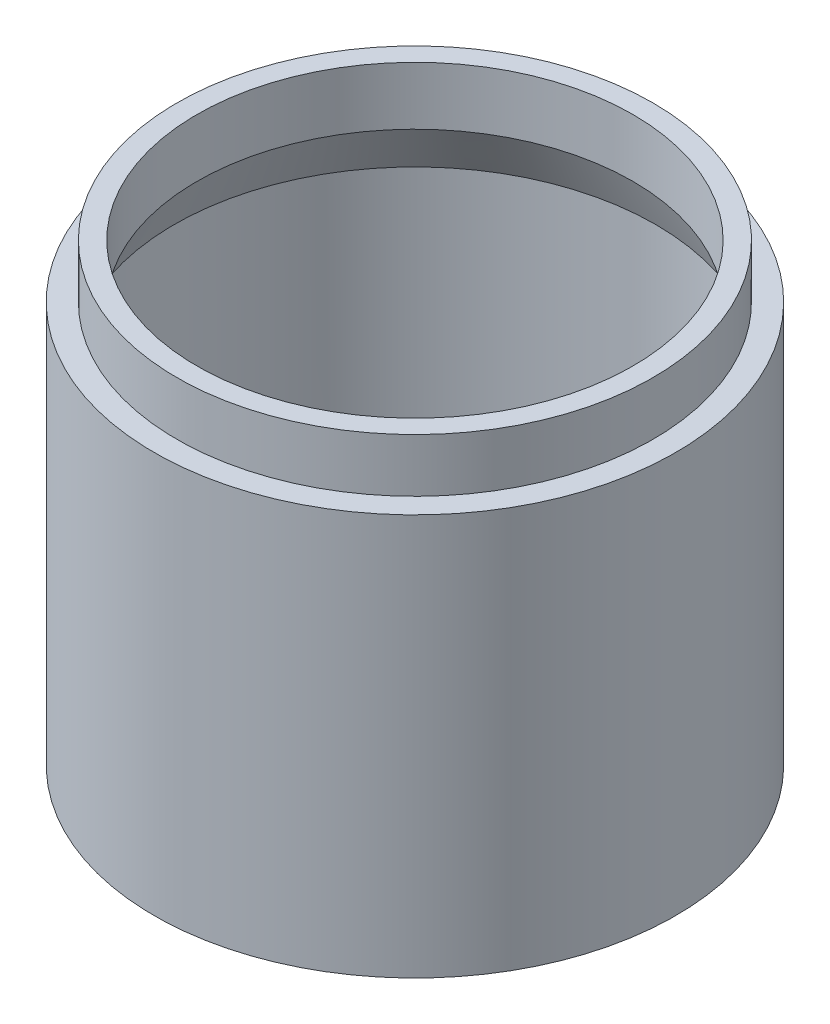
ISO-10303-21;
HEADER;
FILE_DESCRIPTION(('STEP AP214'),'2;1');
FILE_NAME('part.step','',(''),(''),'','','');
FILE_SCHEMA(('AUTOMOTIVE_DESIGN { 1 0 10303 214 1 1 1 1 }'));
ENDSEC;
DATA;
#1=APPLICATION_CONTEXT('core data for automotive mechanical design processes');
#2=APPLICATION_PROTOCOL_DEFINITION('international standard','automotive_design',2000,#1);
#3=PRODUCT_CONTEXT('',#1,'mechanical');
#4=PRODUCT('Part','Part','',(#3));
#5=PRODUCT_RELATED_PRODUCT_CATEGORY('part','',(#4));
#6=PRODUCT_DEFINITION_FORMATION('','',#4);
#7=PRODUCT_DEFINITION_CONTEXT('part definition',#1,'design');
#8=PRODUCT_DEFINITION('design','',#6,#7);
#9=PRODUCT_DEFINITION_SHAPE('','',#8);
#10=(LENGTH_UNIT() NAMED_UNIT(*) SI_UNIT(.MILLI.,.METRE.));
#11=(NAMED_UNIT(*) PLANE_ANGLE_UNIT() SI_UNIT($,.RADIAN.));
#12=(NAMED_UNIT(*) SI_UNIT($,.STERADIAN.) SOLID_ANGLE_UNIT());
#13=UNCERTAINTY_MEASURE_WITH_UNIT(LENGTH_MEASURE(1.E-05),#10,'distance_accuracy_value','');
#14=(GEOMETRIC_REPRESENTATION_CONTEXT(3) GLOBAL_UNCERTAINTY_ASSIGNED_CONTEXT((#13)) GLOBAL_UNIT_ASSIGNED_CONTEXT((#10,
#11,#12)) REPRESENTATION_CONTEXT('',''));
#15=CARTESIAN_POINT('',(0.,0.,0.));
#16=DIRECTION('',(0.,0.,1.));
#17=DIRECTION('',(1.,0.,0.));
#18=AXIS2_PLACEMENT_3D('',#15,#16,#17);
#19=CARTESIAN_POINT('',(0.,0.,0.));
#20=DIRECTION('',(0.,-1.,0.));
#21=DIRECTION('',(0.,0.,-1.));
#22=AXIS2_PLACEMENT_3D('',#19,#20,#21);
#23=CYLINDRICAL_SURFACE('',#22,45.72);
#24=CARTESIAN_POINT('',(0.,-10.1046375474299,0.));
#25=DIRECTION('',(0.,-1.,0.));
#26=DIRECTION('',(0.,0.,-1.));
#27=AXIS2_PLACEMENT_3D('',#24,#25,#26);
#28=CIRCLE('',#27,45.72);
#29=CARTESIAN_POINT('',(0.,-10.1046375474299,-45.72));
#30=VERTEX_POINT('',#29);
#31=EDGE_CURVE('E142',#30,#30,#28,.T.);
#32=ORIENTED_EDGE('',*,*,#31,.F.);
#33=EDGE_LOOP('',(#32));
#34=FACE_BOUND('',#33,.T.);
#35=CARTESIAN_POINT('',(0.,-73.66,0.));
#36=DIRECTION('',(0.,-1.,0.));
#37=DIRECTION('',(0.,0.,-1.));
#38=AXIS2_PLACEMENT_3D('',#35,#36,#37);
#39=CIRCLE('',#38,45.72);
#40=CARTESIAN_POINT('',(45.5034105864604,-73.66,4.44500000000003));
#41=VERTEX_POINT('',#40);
#42=CARTESIAN_POINT('',(-45.5034105864604,-73.66,4.44500000000002));
#43=VERTEX_POINT('',#42);
#44=EDGE_CURVE('E99',#41,#43,#39,.T.);
#45=ORIENTED_EDGE('',*,*,#44,.T.);
#46=CARTESIAN_POINT('',(-45.5034105864604,-73.66,-4.44499999999998));
#47=CARTESIAN_POINT('',(-45.5034053666458,-73.5352969190242,-4.44501376809316));
#48=CARTESIAN_POINT('',(-45.50392303603,-73.4105962105472,-4.43975282545134));
#49=CARTESIAN_POINT('',(-45.5059663925506,-73.1620927551427,-4.4187812644743));
#50=CARTESIAN_POINT('',(-45.5074920137328,-73.0382899499977,-4.40307132985666));
#51=CARTESIAN_POINT('',(-45.5115117193502,-72.7925691862634,-4.36132023399555));
#52=CARTESIAN_POINT('',(-45.5140049341397,-72.6706496370818,-4.3352883493738));
#53=CARTESIAN_POINT('',(-45.5198869212383,-72.4294480382064,-4.27308743638151));
#54=CARTESIAN_POINT('',(-45.523275686007,-72.3101659663143,-4.23691849336493));
#55=CARTESIAN_POINT('',(-45.5308533042162,-72.0750587151427,-4.15469600150712));
#56=CARTESIAN_POINT('',(-45.5350423155661,-71.9592342233577,-4.10864050156992));
#57=CARTESIAN_POINT('',(-45.5441023834616,-71.7318404388327,-4.00696181092924));
#58=CARTESIAN_POINT('',(-45.5489736916022,-71.6202727351689,-3.95133508912879));
#59=CARTESIAN_POINT('',(-45.5592564154922,-71.4022753165274,-3.83095292634324));
#60=CARTESIAN_POINT('',(-45.5646675608258,-71.2958430683401,-3.76620204920287));
#61=CARTESIAN_POINT('',(-45.5758811406676,-71.0887625592665,-3.62798366601361));
#62=CARTESIAN_POINT('',(-45.5816837193799,-70.9881164555675,-3.5545129399185));
#63=CARTESIAN_POINT('',(-45.593530159417,-70.7930997501469,-3.39918925279466));
#64=CARTESIAN_POINT('',(-45.5995746093437,-70.6987461609632,-3.31731497594981));
#65=CARTESIAN_POINT('',(-45.6117218437085,-70.517230522534,-3.14588851409613));
#66=CARTESIAN_POINT('',(-45.6178246488829,-70.4300711443778,-3.05633350229972));
#67=CARTESIAN_POINT('',(-45.6299125978487,-70.2636136921363,-2.87022092290477));
#68=CARTESIAN_POINT('',(-45.6358977667623,-70.1843139246184,-2.77366487154837));
#69=CARTESIAN_POINT('',(-45.6475849771005,-70.034086125315,-2.57417377143073));
#70=CARTESIAN_POINT('',(-45.6532869132164,-69.9631611940737,-2.47123638153558));
#71=CARTESIAN_POINT('',(-45.66425289633,-69.8301146256498,-2.25956937996069));
#72=CARTESIAN_POINT('',(-45.6695162312201,-69.7680071936934,-2.15083080152459));
#73=CARTESIAN_POINT('',(-45.6794473737766,-69.6531541759551,-1.92843975753886));
#74=CARTESIAN_POINT('',(-45.6841149602214,-69.6004120650065,-1.81478548747972));
#75=CARTESIAN_POINT('',(-45.6927176594075,-69.5047209503314,-1.58345823959493));
#76=CARTESIAN_POINT('',(-45.696653099109,-69.4617675732403,-1.46578708353981));
#77=CARTESIAN_POINT('',(-45.7036835891405,-69.3859218372686,-1.22717657758366));
#78=CARTESIAN_POINT('',(-45.7067783309095,-69.3530331718768,-1.1062360455832));
#79=CARTESIAN_POINT('',(-45.7120273889768,-69.2976797065146,-0.862408433279506));
#80=CARTESIAN_POINT('',(-45.7141849791202,-69.2751786010432,-0.739529709092874));
#81=CARTESIAN_POINT('',(-45.7175172910723,-69.2405792393519,-0.492306327812328));
#82=CARTESIAN_POINT('',(-45.7186916710113,-69.2284846014999,-0.367961176057563));
#83=CARTESIAN_POINT('',(-45.7206741721363,-69.2080255266906,0.00594951787953886));
#84=CARTESIAN_POINT('',(-45.7199474507037,-69.2154263255315,0.256653560762508));
#85=CARTESIAN_POINT('',(-45.7158526624879,-69.2578531698899,0.628267289358214));
#86=CARTESIAN_POINT('',(-45.7139908717547,-69.2771755953538,0.7512570066208));
#87=CARTESIAN_POINT('',(-45.7093299429959,-69.3260538571995,0.995171133847586));
#88=CARTESIAN_POINT('',(-45.7065311307986,-69.3556061364995,1.11609624639117));
#89=CARTESIAN_POINT('',(-45.7000716211195,-69.4247494543779,1.35505194352472));
#90=CARTESIAN_POINT('',(-45.6964106148083,-69.4643440904206,1.47308147418029));
#91=CARTESIAN_POINT('',(-45.6883321731246,-69.5532638195735,1.70534354280867));
#92=CARTESIAN_POINT('',(-45.683915012355,-69.6025853812668,1.81957744127199));
#93=CARTESIAN_POINT('',(-45.6744373630694,-69.7107268669212,2.04371795450332));
#94=CARTESIAN_POINT('',(-45.6693755733114,-69.7695660698713,2.15361521072923));
#95=CARTESIAN_POINT('',(-45.6587601084293,-69.8962280860313,2.36802529891206));
#96=CARTESIAN_POINT('',(-45.6532066130589,-69.9640476207407,2.47254007663247));
#97=CARTESIAN_POINT('',(-45.6417600808302,-70.1082324900575,2.67553300070175));
#98=CARTESIAN_POINT('',(-45.6358669276081,-70.1846007619304,2.77400905410281));
#99=CARTESIAN_POINT('',(-45.623910513422,-70.3452977227731,2.96416325195119));
#100=CARTESIAN_POINT('',(-45.6178473152296,-70.4296235007438,3.05584386054922));
#101=CARTESIAN_POINT('',(-45.6056923634233,-70.6060554038518,3.23219308796624));
#102=CARTESIAN_POINT('',(-45.5996006010872,-70.6981939982481,3.31682922535725));
#103=CARTESIAN_POINT('',(-45.5875900343433,-70.8892467143039,3.47801176012189));
#104=CARTESIAN_POINT('',(-45.5816711672893,-70.9881583372878,3.55456111461643));
#105=CARTESIAN_POINT('',(-45.5701681752192,-71.1921611742727,3.69911274652491));
#106=CARTESIAN_POINT('',(-45.5645842797341,-71.2972565300094,3.76710919749373));
#107=CARTESIAN_POINT('',(-45.5539167353921,-71.5127847955353,3.89398555175274));
#108=CARTESIAN_POINT('',(-45.5488329009367,-71.6232157021593,3.95286884209736));
#109=CARTESIAN_POINT('',(-45.5393027802207,-71.8488027643524,4.06118993854184));
#110=CARTESIAN_POINT('',(-45.5348572465654,-71.9639642953315,4.11061661702968));
#111=CARTESIAN_POINT('',(-45.5267400728283,-72.1980289976996,4.19956350385286));
#112=CARTESIAN_POINT('',(-45.5230681395086,-72.3169307316285,4.23908746695137));
#113=CARTESIAN_POINT('',(-45.5166053047668,-72.5575343869774,4.3079271673387));
#114=CARTESIAN_POINT('',(-45.5138134524328,-72.6792331326196,4.33725392608083));
#115=CARTESIAN_POINT('',(-45.5091869029959,-72.9246393339078,4.38553268694374));
#116=CARTESIAN_POINT('',(-45.5073517398428,-73.0483457811612,4.40448974087812));
#117=CARTESIAN_POINT('',(-45.5051533729861,-73.2535894524837,4.42713173450527));
#118=CARTESIAN_POINT('',(-45.5045000958908,-73.3348027377774,4.43383641795046));
#119=CARTESIAN_POINT('',(-45.5036286816613,-73.497341265294,4.44276746742395));
#120=CARTESIAN_POINT('',(-45.5034098188453,-73.578666093327,4.44500130198192));
#121=CARTESIAN_POINT('',(-45.5034105864604,-73.66,4.44500000000002));
#122=B_SPLINE_CURVE_WITH_KNOTS('',3,(#46,#47,#48,#49,#50,#51,#52,#53,#54,#55,#56,#57,#58,#59,
#60,#61,#62,#63,#64,#65,#66,#67,#68,#69,#70,#71,#72,#73,#74,#75,#76,#77,#78,#79,#80,#81,#82,#83,
#84,#85,#86,#87,#88,#89,#90,#91,#92,#93,#94,#95,#96,#97,#98,#99,#100,#101,#102,#103,#104,#105,
#106,#107,#108,#109,#110,#111,#112,#113,#114,#115,#116,#117,#118,#119,#120,#121),.UNSPECIFIED.,
.F.,.F.,(4,2,2,2,2,2,2,2,2,2,2,2,2,2,2,2,2,2,2,2,2,2,2,2,2,2,2,2,2,2,2,2,2,2,2,2,2,4),(0.,
0.373993814862765,0.747963160284568,1.12159716815652,1.49522803012752,1.86893269544173,
2.24277552785612,2.61643202587905,2.99022693878813,3.36499459069129,3.7399007673994,
4.11472599036728,4.48968954945684,4.86525049178544,5.24095048937785,5.61648230297382,
5.99215176222695,6.36649809101354,6.74097452888663,7.48912722561356,7.86233236853873,
8.2354078722758,8.60861721174724,8.98169130401254,9.3555307849144,9.72923416047709,
10.1030663334075,10.4767622780558,10.8520954927055,11.2272909794276,11.6027406898808,
11.97805052149,12.35379930073,12.7294053928372,13.104604247072,13.4796201523572,
13.7239814456942,13.9679341929181),.UNSPECIFIED.);
#123=CARTESIAN_POINT('',(-45.5034105864604,-73.66,-4.44499999999998));
#124=VERTEX_POINT('',#123);
#125=EDGE_CURVE('E188',#124,#43,#122,.T.);
#126=ORIENTED_EDGE('',*,*,#125,.F.);
#127=CARTESIAN_POINT('',(45.5034105864604,-73.66,-4.44499999999998));
#128=VERTEX_POINT('',#127);
#129=EDGE_CURVE('E115',#124,#128,#39,.T.);
#130=ORIENTED_EDGE('',*,*,#129,.T.);
#131=CARTESIAN_POINT('',(45.5034105864604,-73.66,-4.44499999999998));
#132=CARTESIAN_POINT('',(45.5034053666458,-73.5352969190242,-4.44501376809316));
#133=CARTESIAN_POINT('',(45.50392303603,-73.4105962105472,-4.43975282545134));
#134=CARTESIAN_POINT('',(45.5059663925506,-73.1620927551427,-4.4187812644743));
#135=CARTESIAN_POINT('',(45.5074920137328,-73.0382899499977,-4.40307132985666));
#136=CARTESIAN_POINT('',(45.5115117193502,-72.7925691862634,-4.36132023399555));
#137=CARTESIAN_POINT('',(45.5140049341397,-72.6706496370818,-4.3352883493738));
#138=CARTESIAN_POINT('',(45.5198869212383,-72.4294480382064,-4.27308743638151));
#139=CARTESIAN_POINT('',(45.523275686007,-72.3101659663143,-4.23691849336493));
#140=CARTESIAN_POINT('',(45.5308533042162,-72.0750587151427,-4.15469600150712));
#141=CARTESIAN_POINT('',(45.5350423155661,-71.9592342233577,-4.10864050156992));
#142=CARTESIAN_POINT('',(45.5441023834616,-71.7318404388327,-4.00696181092924));
#143=CARTESIAN_POINT('',(45.5489736916022,-71.6202727351689,-3.95133508912879));
#144=CARTESIAN_POINT('',(45.5592564154922,-71.4022753165274,-3.83095292634324));
#145=CARTESIAN_POINT('',(45.5646675608258,-71.2958430683401,-3.76620204920287));
#146=CARTESIAN_POINT('',(45.5758811406676,-71.0887625592665,-3.62798366601361));
#147=CARTESIAN_POINT('',(45.5816837193799,-70.9881164555675,-3.5545129399185));
#148=CARTESIAN_POINT('',(45.593530159417,-70.7930997501469,-3.39918925279466));
#149=CARTESIAN_POINT('',(45.5995746093437,-70.6987461609632,-3.31731497594981));
#150=CARTESIAN_POINT('',(45.6117218437085,-70.517230522534,-3.14588851409613));
#151=CARTESIAN_POINT('',(45.6178246488829,-70.4300711443778,-3.05633350229972));
#152=CARTESIAN_POINT('',(45.6299125978487,-70.2636136921363,-2.87022092290477));
#153=CARTESIAN_POINT('',(45.6358977667623,-70.1843139246184,-2.77366487154837));
#154=CARTESIAN_POINT('',(45.6475849771005,-70.034086125315,-2.57417377143073));
#155=CARTESIAN_POINT('',(45.6532869132164,-69.9631611940737,-2.47123638153558));
#156=CARTESIAN_POINT('',(45.66425289633,-69.8301146256498,-2.25956937996069));
#157=CARTESIAN_POINT('',(45.6695162312201,-69.7680071936934,-2.15083080152459));
#158=CARTESIAN_POINT('',(45.6794473737766,-69.6531541759551,-1.92843975753886));
#159=CARTESIAN_POINT('',(45.6841149602214,-69.6004120650065,-1.81478548747972));
#160=CARTESIAN_POINT('',(45.6927176594075,-69.5047209503314,-1.58345823959493));
#161=CARTESIAN_POINT('',(45.696653099109,-69.4617675732403,-1.46578708353981));
#162=CARTESIAN_POINT('',(45.7036835891405,-69.3859218372686,-1.22717657758366));
#163=CARTESIAN_POINT('',(45.7067783309095,-69.3530331718768,-1.1062360455832));
#164=CARTESIAN_POINT('',(45.7120273889768,-69.2976797065146,-0.862408433279506));
#165=CARTESIAN_POINT('',(45.7141849791202,-69.2751786010432,-0.739529709092874));
#166=CARTESIAN_POINT('',(45.7175172910723,-69.2405792393519,-0.492306327812328));
#167=CARTESIAN_POINT('',(45.7186916710113,-69.2284846014999,-0.367961176057563));
#168=CARTESIAN_POINT('',(45.7206741721363,-69.2080255266906,0.00594951787953886));
#169=CARTESIAN_POINT('',(45.7199474507037,-69.2154263255315,0.256653560762508));
#170=CARTESIAN_POINT('',(45.7158526624879,-69.2578531698899,0.628267289358214));
#171=CARTESIAN_POINT('',(45.7139908717547,-69.2771755953538,0.7512570066208));
#172=CARTESIAN_POINT('',(45.7093299429959,-69.3260538571995,0.995171133847586));
#173=CARTESIAN_POINT('',(45.7065311307986,-69.3556061364995,1.11609624639117));
#174=CARTESIAN_POINT('',(45.7000716211195,-69.4247494543779,1.35505194352472));
#175=CARTESIAN_POINT('',(45.6964106148083,-69.4643440904206,1.47308147418029));
#176=CARTESIAN_POINT('',(45.6883321731246,-69.5532638195735,1.70534354280867));
#177=CARTESIAN_POINT('',(45.683915012355,-69.6025853812668,1.81957744127199));
#178=CARTESIAN_POINT('',(45.6744373630694,-69.7107268669212,2.04371795450332));
#179=CARTESIAN_POINT('',(45.6693755733114,-69.7695660698713,2.15361521072923));
#180=CARTESIAN_POINT('',(45.6587601084293,-69.8962280860313,2.36802529891206));
#181=CARTESIAN_POINT('',(45.6532066130589,-69.9640476207407,2.47254007663247));
#182=CARTESIAN_POINT('',(45.6417600808302,-70.1082324900575,2.67553300070175));
#183=CARTESIAN_POINT('',(45.6358669276081,-70.1846007619304,2.77400905410281));
#184=CARTESIAN_POINT('',(45.623910513422,-70.3452977227731,2.96416325195119));
#185=CARTESIAN_POINT('',(45.6178473152296,-70.4296235007438,3.05584386054922));
#186=CARTESIAN_POINT('',(45.6056923634233,-70.6060554038518,3.23219308796624));
#187=CARTESIAN_POINT('',(45.5996006010872,-70.6981939982481,3.31682922535725));
#188=CARTESIAN_POINT('',(45.5875900343433,-70.8892467143039,3.47801176012189));
#189=CARTESIAN_POINT('',(45.5816711672893,-70.9881583372878,3.55456111461643));
#190=CARTESIAN_POINT('',(45.5701681752192,-71.1921611742727,3.69911274652491));
#191=CARTESIAN_POINT('',(45.5645842797341,-71.2972565300094,3.76710919749373));
#192=CARTESIAN_POINT('',(45.5539167353921,-71.5127847955353,3.89398555175274));
#193=CARTESIAN_POINT('',(45.5488329009367,-71.6232157021593,3.95286884209736));
#194=CARTESIAN_POINT('',(45.5393027802207,-71.8488027643524,4.06118993854184));
#195=CARTESIAN_POINT('',(45.5348572465654,-71.9639642953315,4.11061661702968));
#196=CARTESIAN_POINT('',(45.5267400728283,-72.1980289976996,4.19956350385286));
#197=CARTESIAN_POINT('',(45.5230681395086,-72.3169307316285,4.23908746695137));
#198=CARTESIAN_POINT('',(45.5166053047668,-72.5575343869774,4.3079271673387));
#199=CARTESIAN_POINT('',(45.5138134524328,-72.6792331326196,4.33725392608083));
#200=CARTESIAN_POINT('',(45.5091869029959,-72.9246393339078,4.38553268694374));
#201=CARTESIAN_POINT('',(45.5073517398428,-73.0483457811612,4.40448974087812));
#202=CARTESIAN_POINT('',(45.5051533729861,-73.2535894524837,4.42713173450527));
#203=CARTESIAN_POINT('',(45.5045000958908,-73.3348027377774,4.43383641795046));
#204=CARTESIAN_POINT('',(45.5036286816613,-73.497341265294,4.44276746742395));
#205=CARTESIAN_POINT('',(45.5034098188453,-73.578666093327,4.44500130198192));
#206=CARTESIAN_POINT('',(45.5034105864604,-73.66,4.44500000000002));
#207=B_SPLINE_CURVE_WITH_KNOTS('',3,(#131,#132,#133,#134,#135,#136,#137,#138,#139,#140,#141,
#142,#143,#144,#145,#146,#147,#148,#149,#150,#151,#152,#153,#154,#155,#156,#157,#158,#159,#160,
#161,#162,#163,#164,#165,#166,#167,#168,#169,#170,#171,#172,#173,#174,#175,#176,#177,#178,#179,
#180,#181,#182,#183,#184,#185,#186,#187,#188,#189,#190,#191,#192,#193,#194,#195,#196,#197,#198,
#199,#200,#201,#202,#203,#204,#205,#206),.UNSPECIFIED.,.F.,.F.,(4,2,2,2,2,2,2,2,2,2,2,2,2,2,2,2,
2,2,2,2,2,2,2,2,2,2,2,2,2,2,2,2,2,2,2,2,2,4),(0.,0.373993814862765,0.747963160284568,
1.12159716815652,1.49522803012752,1.86893269544173,2.24277552785612,2.61643202587905,
2.99022693878813,3.36499459069129,3.7399007673994,4.11472599036728,4.48968954945684,
4.86525049178544,5.24095048937785,5.61648230297382,5.99215176222695,6.36649809101354,
6.74097452888663,7.48912722561356,7.86233236853873,8.2354078722758,8.60861721174724,
8.98169130401254,9.3555307849144,9.72923416047709,10.1030663334075,10.4767622780558,
10.8520954927055,11.2272909794276,11.6027406898808,11.97805052149,12.35379930073,
12.7294053928372,13.104604247072,13.4796201523572,13.7239814456942,13.9679341929181),.UNSPECIFIED.);
#208=EDGE_CURVE('E190',#128,#41,#207,.T.);
#209=ORIENTED_EDGE('',*,*,#208,.T.);
#210=EDGE_LOOP('',(#45,#126,#130,#209));
#211=FACE_BOUND('',#210,.T.);
#212=ADVANCED_FACE('F40',(#34,#211),#23,.F.);
#213=CARTESIAN_POINT('',(-49.532,-73.66,4.44500000000002));
#214=DIRECTION('',(0.,0.,1.));
#215=DIRECTION('',(1.,0.,0.));
#216=AXIS2_PLACEMENT_3D('',#213,#214,#215);
#217=PLANE('',#216);
#218=DIRECTION('',(1.,0.,0.));
#219=VECTOR('',#218,1.);
#220=CARTESIAN_POINT('',(-49.532,-73.66,4.44500000000002));
#221=LINE('',#220,#219);
#222=CARTESIAN_POINT('',(-26.2969746358778,-73.66,4.44500000000002));
#223=VERTEX_POINT('',#222);
#224=CARTESIAN_POINT('',(26.2969746358778,-73.66,4.44500000000002));
#225=VERTEX_POINT('',#224);
#226=EDGE_CURVE('E104',#223,#225,#221,.T.);
#227=ORIENTED_EDGE('',*,*,#226,.F.);
#228=DIRECTION('',(0.,-1.,0.));
#229=VECTOR('',#228,1.);
#230=CARTESIAN_POINT('',(-26.2969746358778,-73.66,4.44500000000002));
#231=LINE('',#230,#229);
#232=CARTESIAN_POINT('',(-26.2969746358778,-76.2,4.44500000000002));
#233=VERTEX_POINT('',#232);
#234=EDGE_CURVE('E114',#223,#233,#231,.T.);
#235=ORIENTED_EDGE('',*,*,#234,.T.);
#236=DIRECTION('',(1.,0.,0.));
#237=VECTOR('',#236,1.);
#238=CARTESIAN_POINT('',(-49.532,-76.2,4.44500000000002));
#239=LINE('',#238,#237);
#240=CARTESIAN_POINT('',(26.2969746358778,-76.2,4.44500000000002));
#241=VERTEX_POINT('',#240);
#242=EDGE_CURVE('E123',#233,#241,#239,.T.);
#243=ORIENTED_EDGE('',*,*,#242,.T.);
#244=DIRECTION('',(0.,-1.,0.));
#245=VECTOR('',#244,1.);
#246=CARTESIAN_POINT('',(26.2969746358778,-73.66,4.44500000000002));
#247=LINE('',#246,#245);
#248=EDGE_CURVE('E111',#241,#225,#247,.F.);
#249=ORIENTED_EDGE('',*,*,#248,.T.);
#250=EDGE_LOOP('',(#227,#235,#243,#249));
#251=FACE_BOUND('',#250,.T.);
#252=ADVANCED_FACE('F120',(#251),#217,.T.);
#253=CARTESIAN_POINT('',(-49.532,-73.66,-4.44499999999998));
#254=DIRECTION('',(0.,0.,-1.));
#255=DIRECTION('',(0.,1.,0.));
#256=AXIS2_PLACEMENT_3D('',#253,#254,#255);
#257=PLANE('',#256);
#258=DIRECTION('',(1.,0.,0.));
#259=VECTOR('',#258,1.);
#260=CARTESIAN_POINT('',(-49.532,-73.66,-4.44499999999998));
#261=LINE('',#260,#259);
#262=CARTESIAN_POINT('',(-26.2969746358778,-73.66,-4.44499999999998));
#263=VERTEX_POINT('',#262);
#264=CARTESIAN_POINT('',(26.2969746358778,-73.66,-4.44499999999998));
#265=VERTEX_POINT('',#264);
#266=EDGE_CURVE('E219',#263,#265,#261,.T.);
#267=ORIENTED_EDGE('',*,*,#266,.T.);
#268=DIRECTION('',(0.,-1.,0.));
#269=VECTOR('',#268,1.);
#270=CARTESIAN_POINT('',(26.2969746358778,-73.66,-4.44499999999998));
#271=LINE('',#270,#269);
#272=CARTESIAN_POINT('',(26.2969746358778,-76.2,-4.44499999999998));
#273=VERTEX_POINT('',#272);
#274=EDGE_CURVE('E55',#265,#273,#271,.T.);
#275=ORIENTED_EDGE('',*,*,#274,.T.);
#276=DIRECTION('',(1.,0.,0.));
#277=VECTOR('',#276,1.);
#278=CARTESIAN_POINT('',(-49.532,-76.2,-4.44499999999998));
#279=LINE('',#278,#277);
#280=CARTESIAN_POINT('',(-26.2969746358778,-76.2,-4.44499999999998));
#281=VERTEX_POINT('',#280);
#282=EDGE_CURVE('E59',#281,#273,#279,.T.);
#283=ORIENTED_EDGE('',*,*,#282,.F.);
#284=DIRECTION('',(0.,-1.,0.));
#285=VECTOR('',#284,1.);
#286=CARTESIAN_POINT('',(-26.2969746358778,-73.66,-4.44499999999998));
#287=LINE('',#286,#285);
#288=EDGE_CURVE('E191',#281,#263,#287,.F.);
#289=ORIENTED_EDGE('',*,*,#288,.T.);
#290=EDGE_LOOP('',(#267,#275,#283,#289));
#291=FACE_BOUND('',#290,.T.);
#292=ADVANCED_FACE('F157',(#291),#257,.T.);
#293=CARTESIAN_POINT('',(0.,0.,45.212));
#294=DIRECTION('',(0.,-1.,0.));
#295=DIRECTION('',(0.,0.,-1.));
#296=AXIS2_PLACEMENT_3D('',#293,#294,#295);
#297=PLANE('',#296);
#298=CARTESIAN_POINT('',(0.,0.,0.));
#299=DIRECTION('',(0.,-1.,0.));
#300=DIRECTION('',(0.,0.,-1.));
#301=AXIS2_PLACEMENT_3D('',#298,#299,#300);
#302=CIRCLE('',#301,49.53);
#303=CARTESIAN_POINT('',(0.,0.,-49.53));
#304=VERTEX_POINT('',#303);
#305=EDGE_CURVE('E12',#304,#304,#302,.T.);
#306=ORIENTED_EDGE('',*,*,#305,.F.);
#307=EDGE_LOOP('',(#306));
#308=FACE_BOUND('',#307,.T.);
#309=CARTESIAN_POINT('',(0.,0.,0.));
#310=DIRECTION('',(0.,-1.,0.));
#311=DIRECTION('',(0.,0.,-1.));
#312=AXIS2_PLACEMENT_3D('',#309,#310,#311);
#313=CIRCLE('',#312,45.212);
#314=CARTESIAN_POINT('',(0.,0.,-45.212));
#315=VERTEX_POINT('',#314);
#316=EDGE_CURVE('E127',#315,#315,#313,.T.);
#317=ORIENTED_EDGE('',*,*,#316,.T.);
#318=EDGE_LOOP('',(#317));
#319=FACE_BOUND('',#318,.T.);
#320=ADVANCED_FACE('F42',(#308,#319),#297,.F.);
#321=CARTESIAN_POINT('',(0.,0.,0.));
#322=DIRECTION('',(0.,-1.,0.));
#323=DIRECTION('',(0.,0.,-1.));
#324=AXIS2_PLACEMENT_3D('',#321,#322,#323);
#325=CYLINDRICAL_SURFACE('',#324,49.53);
#326=CARTESIAN_POINT('',(0.,-76.2,0.));
#327=DIRECTION('',(0.,-1.,0.));
#328=DIRECTION('',(0.,0.,-1.));
#329=AXIS2_PLACEMENT_3D('',#326,#327,#328);
#330=CIRCLE('',#329,49.53);
#331=CARTESIAN_POINT('',(0.,-76.2,-49.53));
#332=VERTEX_POINT('',#331);
#333=EDGE_CURVE('E48',#332,#332,#330,.T.);
#334=ORIENTED_EDGE('',*,*,#333,.F.);
#335=EDGE_LOOP('',(#334));
#336=FACE_BOUND('',#335,.T.);
#337=ORIENTED_EDGE('',*,*,#305,.T.);
#338=EDGE_LOOP('',(#337));
#339=FACE_BOUND('',#338,.T.);
#340=ADVANCED_FACE('F150',(#336,#339),#325,.T.);
#341=CARTESIAN_POINT('',(0.,-76.2,49.53));
#342=DIRECTION('',(0.,1.,0.));
#343=DIRECTION('',(0.,0.,1.));
#344=AXIS2_PLACEMENT_3D('',#341,#342,#343);
#345=PLANE('',#344);
#346=ORIENTED_EDGE('',*,*,#282,.T.);
#347=CARTESIAN_POINT('',(0.,-76.2,0.));
#348=DIRECTION('',(0.,-1.,0.));
#349=DIRECTION('',(1.,0.,0.));
#350=AXIS2_PLACEMENT_3D('',#347,#348,#349);
#351=CIRCLE('',#350,26.67);
#352=EDGE_CURVE('E227',#281,#273,#351,.T.);
#353=ORIENTED_EDGE('',*,*,#352,.F.);
#354=EDGE_LOOP('',(#346,#353));
#355=FACE_BOUND('',#354,.T.);
#356=ORIENTED_EDGE('',*,*,#333,.T.);
#357=EDGE_LOOP('',(#356));
#358=FACE_BOUND('',#357,.T.);
#359=EDGE_CURVE('E232',#241,#233,#351,.T.);
#360=ORIENTED_EDGE('',*,*,#359,.F.);
#361=ORIENTED_EDGE('',*,*,#242,.F.);
#362=EDGE_LOOP('',(#360,#361));
#363=FACE_BOUND('',#362,.T.);
#364=ADVANCED_FACE('F147',(#355,#358,#363),#345,.F.);
#365=CARTESIAN_POINT('',(0.,-10.1046375474299,0.));
#366=DIRECTION('',(0.,-1.,0.));
#367=DIRECTION('',(0.,0.,-1.));
#368=AXIS2_PLACEMENT_3D('',#365,#366,#367);
#369=CONICAL_SURFACE('',#368,45.72,0.436332312998583);
#370=CARTESIAN_POINT('',(0.,-0.844656664669606,0.));
#371=DIRECTION('',(0.,-1.,0.));
#372=DIRECTION('',(0.,0.,-1.));
#373=AXIS2_PLACEMENT_3D('',#370,#371,#372);
#374=CIRCLE('',#373,41.402);
#375=CARTESIAN_POINT('',(0.,-0.844656664669606,-41.402));
#376=VERTEX_POINT('',#375);
#377=EDGE_CURVE('E139',#376,#376,#374,.T.);
#378=ORIENTED_EDGE('',*,*,#377,.F.);
#379=EDGE_LOOP('',(#378));
#380=FACE_BOUND('',#379,.T.);
#381=ORIENTED_EDGE('',*,*,#31,.T.);
#382=EDGE_LOOP('',(#381));
#383=FACE_BOUND('',#382,.T.);
#384=ADVANCED_FACE('F175',(#380,#383),#369,.F.);
#385=CARTESIAN_POINT('',(0.,0.,0.));
#386=DIRECTION('',(0.,-1.,0.));
#387=DIRECTION('',(0.,0.,-1.));
#388=AXIS2_PLACEMENT_3D('',#385,#386,#387);
#389=CYLINDRICAL_SURFACE('',#388,41.402);
#390=CARTESIAN_POINT('',(0.,10.16,0.));
#391=DIRECTION('',(0.,-1.,0.));
#392=DIRECTION('',(0.,0.,-1.));
#393=AXIS2_PLACEMENT_3D('',#390,#391,#392);
#394=CIRCLE('',#393,41.402);
#395=CARTESIAN_POINT('',(0.,10.16,-41.402));
#396=VERTEX_POINT('',#395);
#397=EDGE_CURVE('E136',#396,#396,#394,.T.);
#398=ORIENTED_EDGE('',*,*,#397,.F.);
#399=EDGE_LOOP('',(#398));
#400=FACE_BOUND('',#399,.T.);
#401=ORIENTED_EDGE('',*,*,#377,.T.);
#402=EDGE_LOOP('',(#401));
#403=FACE_BOUND('',#402,.T.);
#404=ADVANCED_FACE('F169',(#400,#403),#389,.F.);
#405=CARTESIAN_POINT('',(0.,10.16,41.402));
#406=DIRECTION('',(0.,-1.,0.));
#407=DIRECTION('',(0.,0.,-1.));
#408=AXIS2_PLACEMENT_3D('',#405,#406,#407);
#409=PLANE('',#408);
#410=CARTESIAN_POINT('',(0.,10.16,0.));
#411=DIRECTION('',(0.,-1.,0.));
#412=DIRECTION('',(0.,0.,-1.));
#413=AXIS2_PLACEMENT_3D('',#410,#411,#412);
#414=CIRCLE('',#413,45.212);
#415=CARTESIAN_POINT('',(0.,10.16,-45.212));
#416=VERTEX_POINT('',#415);
#417=EDGE_CURVE('E133',#416,#416,#414,.T.);
#418=ORIENTED_EDGE('',*,*,#417,.F.);
#419=EDGE_LOOP('',(#418));
#420=FACE_BOUND('',#419,.T.);
#421=ORIENTED_EDGE('',*,*,#397,.T.);
#422=EDGE_LOOP('',(#421));
#423=FACE_BOUND('',#422,.T.);
#424=ADVANCED_FACE('F163',(#420,#423),#409,.F.);
#425=CARTESIAN_POINT('',(0.,0.,0.));
#426=DIRECTION('',(0.,-1.,0.));
#427=DIRECTION('',(0.,0.,-1.));
#428=AXIS2_PLACEMENT_3D('',#425,#426,#427);
#429=CYLINDRICAL_SURFACE('',#428,45.212);
#430=ORIENTED_EDGE('',*,*,#316,.F.);
#431=EDGE_LOOP('',(#430));
#432=FACE_BOUND('',#431,.T.);
#433=ORIENTED_EDGE('',*,*,#417,.T.);
#434=EDGE_LOOP('',(#433));
#435=FACE_BOUND('',#434,.T.);
#436=ADVANCED_FACE('F160',(#432,#435),#429,.T.);
#437=CARTESIAN_POINT('',(-49.532,-73.66,0.));
#438=DIRECTION('',(1.,0.,0.));
#439=DIRECTION('',(0.,0.,-1.));
#440=AXIS2_PLACEMENT_3D('',#437,#438,#439);
#441=CYLINDRICAL_SURFACE('',#440,4.445);
#442=EDGE_CURVE('E105',#124,#263,#261,.T.);
#443=ORIENTED_EDGE('',*,*,#442,.F.);
#444=ORIENTED_EDGE('',*,*,#125,.T.);
#445=EDGE_CURVE('E107',#43,#223,#221,.T.);
#446=ORIENTED_EDGE('',*,*,#445,.T.);
#447=ORIENTED_EDGE('',*,*,#226,.T.);
#448=EDGE_CURVE('E93',#225,#41,#221,.T.);
#449=ORIENTED_EDGE('',*,*,#448,.T.);
#450=ORIENTED_EDGE('',*,*,#208,.F.);
#451=EDGE_CURVE('E220',#265,#128,#261,.T.);
#452=ORIENTED_EDGE('',*,*,#451,.F.);
#453=ORIENTED_EDGE('',*,*,#266,.F.);
#454=EDGE_LOOP('',(#443,#444,#446,#447,#449,#450,#452,#453));
#455=FACE_BOUND('',#454,.T.);
#456=ADVANCED_FACE('F125',(#455),#441,.T.);
#457=CARTESIAN_POINT('',(0.,-73.66,0.));
#458=DIRECTION('',(0.,-1.,0.));
#459=DIRECTION('',(0.,0.,-1.));
#460=AXIS2_PLACEMENT_3D('',#457,#458,#459);
#461=PLANE('',#460);
#462=ORIENTED_EDGE('',*,*,#445,.F.);
#463=ORIENTED_EDGE('',*,*,#44,.F.);
#464=ORIENTED_EDGE('',*,*,#448,.F.);
#465=CARTESIAN_POINT('',(0.,-73.66,0.));
#466=DIRECTION('',(0.,-1.,0.));
#467=DIRECTION('',(1.,0.,0.));
#468=AXIS2_PLACEMENT_3D('',#465,#466,#467);
#469=CIRCLE('',#468,26.67);
#470=EDGE_CURVE('E96',#225,#223,#469,.T.);
#471=ORIENTED_EDGE('',*,*,#470,.T.);
#472=EDGE_LOOP('',(#462,#463,#464,#471));
#473=FACE_BOUND('',#472,.T.);
#474=ADVANCED_FACE('F95',(#473),#461,.F.);
#475=CARTESIAN_POINT('',(0.,-73.66,0.));
#476=DIRECTION('',(0.,-1.,0.));
#477=DIRECTION('',(0.,0.,-1.));
#478=AXIS2_PLACEMENT_3D('',#475,#476,#477);
#479=CYLINDRICAL_SURFACE('',#478,26.67);
#480=ORIENTED_EDGE('',*,*,#234,.F.);
#481=ORIENTED_EDGE('',*,*,#470,.F.);
#482=ORIENTED_EDGE('',*,*,#248,.F.);
#483=ORIENTED_EDGE('',*,*,#359,.T.);
#484=EDGE_LOOP('',(#480,#481,#482,#483));
#485=FACE_BOUND('',#484,.T.);
#486=ADVANCED_FACE('F110',(#485),#479,.F.);
#487=ORIENTED_EDGE('',*,*,#451,.T.);
#488=ORIENTED_EDGE('',*,*,#129,.F.);
#489=ORIENTED_EDGE('',*,*,#442,.T.);
#490=EDGE_CURVE('E116',#263,#265,#469,.T.);
#491=ORIENTED_EDGE('',*,*,#490,.T.);
#492=EDGE_LOOP('',(#487,#488,#489,#491));
#493=FACE_BOUND('',#492,.T.);
#494=ADVANCED_FACE('F231',(#493),#461,.F.);
#495=ORIENTED_EDGE('',*,*,#274,.F.);
#496=ORIENTED_EDGE('',*,*,#490,.F.);
#497=ORIENTED_EDGE('',*,*,#288,.F.);
#498=ORIENTED_EDGE('',*,*,#352,.T.);
#499=EDGE_LOOP('',(#495,#496,#497,#498));
#500=FACE_BOUND('',#499,.T.);
#501=ADVANCED_FACE('F225',(#500),#479,.F.);
#502=CLOSED_SHELL('',(#212,#252,#292,#320,#340,#364,#384,#404,#424,#436,#456,#474,#486,#494,#501));
#503=MANIFOLD_SOLID_BREP('B2',#502);
#504=ADVANCED_BREP_SHAPE_REPRESENTATION('',(#18,#503),#14);
#505=SHAPE_DEFINITION_REPRESENTATION(#9,#504);
ENDSEC;
END-ISO-10303-21;
